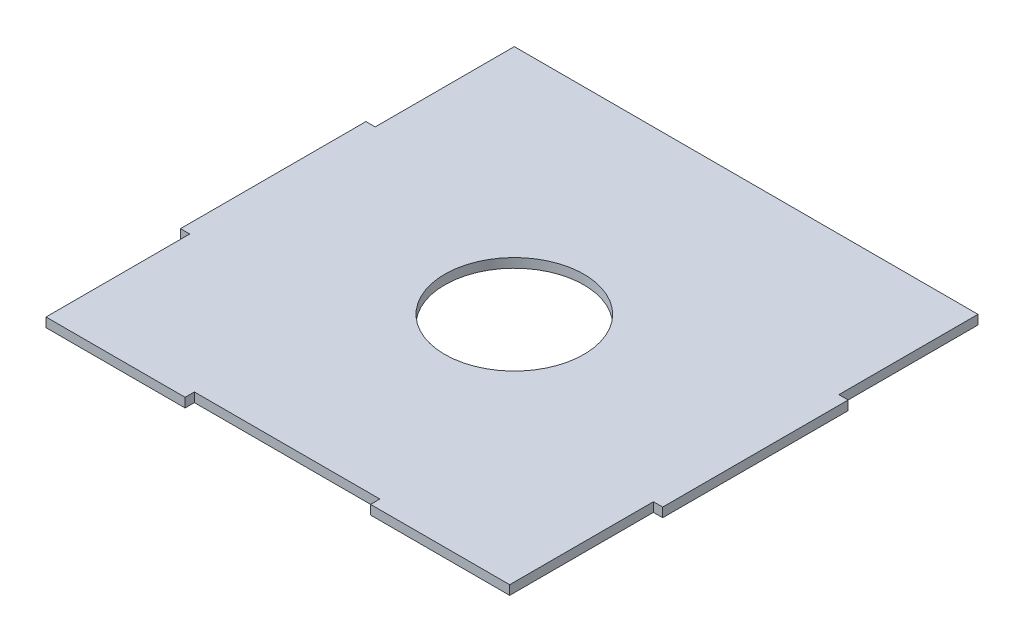
ISO-10303-21;
HEADER;
FILE_DESCRIPTION(('STEP AP214'),'2;1');
FILE_NAME('part.step','',(''),(''),'','','');
FILE_SCHEMA(('AUTOMOTIVE_DESIGN { 1 0 10303 214 1 1 1 1 }'));
ENDSEC;
DATA;
#1=APPLICATION_CONTEXT('core data for automotive mechanical design processes');
#2=APPLICATION_PROTOCOL_DEFINITION('international standard','automotive_design',2000,#1);
#3=PRODUCT_CONTEXT('',#1,'mechanical');
#4=PRODUCT('Part','Part','',(#3));
#5=PRODUCT_RELATED_PRODUCT_CATEGORY('part','',(#4));
#6=PRODUCT_DEFINITION_FORMATION('','',#4);
#7=PRODUCT_DEFINITION_CONTEXT('part definition',#1,'design');
#8=PRODUCT_DEFINITION('design','',#6,#7);
#9=PRODUCT_DEFINITION_SHAPE('','',#8);
#10=(LENGTH_UNIT() NAMED_UNIT(*) SI_UNIT(.MILLI.,.METRE.));
#11=(NAMED_UNIT(*) PLANE_ANGLE_UNIT() SI_UNIT($,.RADIAN.));
#12=(NAMED_UNIT(*) SI_UNIT($,.STERADIAN.) SOLID_ANGLE_UNIT());
#13=UNCERTAINTY_MEASURE_WITH_UNIT(LENGTH_MEASURE(1.E-05),#10,'distance_accuracy_value','');
#14=(GEOMETRIC_REPRESENTATION_CONTEXT(3) GLOBAL_UNCERTAINTY_ASSIGNED_CONTEXT((#13)) GLOBAL_UNIT_ASSIGNED_CONTEXT((#10,
#11,#12)) REPRESENTATION_CONTEXT('',''));
#15=CARTESIAN_POINT('',(0.,0.,0.));
#16=DIRECTION('',(0.,0.,1.));
#17=DIRECTION('',(1.,0.,0.));
#18=AXIS2_PLACEMENT_3D('',#15,#16,#17);
#19=CARTESIAN_POINT('',(50.,2.,-50.));
#20=DIRECTION('',(0.,-1.,0.));
#21=DIRECTION('',(0.,0.,-1.));
#22=AXIS2_PLACEMENT_3D('',#19,#20,#21);
#23=CYLINDRICAL_SURFACE('',#22,15.);
#24=CARTESIAN_POINT('',(50.,2.,-50.));
#25=DIRECTION('',(0.,1.,0.));
#26=DIRECTION('',(0.,0.,1.));
#27=AXIS2_PLACEMENT_3D('',#24,#25,#26);
#28=CIRCLE('',#27,15.);
#29=CARTESIAN_POINT('',(50.,2.,-35.));
#30=VERTEX_POINT('',#29);
#31=EDGE_CURVE('E213',#30,#30,#28,.T.);
#32=ORIENTED_EDGE('',*,*,#31,.T.);
#33=EDGE_LOOP('',(#32));
#34=FACE_BOUND('',#33,.T.);
#35=CARTESIAN_POINT('',(50.,0.,-50.));
#36=DIRECTION('',(0.,1.,0.));
#37=DIRECTION('',(0.,0.,1.));
#38=AXIS2_PLACEMENT_3D('',#35,#36,#37);
#39=CIRCLE('',#38,15.);
#40=CARTESIAN_POINT('',(50.,0.,-35.));
#41=VERTEX_POINT('',#40);
#42=EDGE_CURVE('E214',#41,#41,#39,.T.);
#43=ORIENTED_EDGE('',*,*,#42,.F.);
#44=EDGE_LOOP('',(#43));
#45=FACE_BOUND('',#44,.T.);
#46=ADVANCED_FACE('F45',(#34,#45),#23,.F.);
#47=CARTESIAN_POINT('',(0.,2.,-30.));
#48=DIRECTION('',(0.,0.,-1.));
#49=DIRECTION('',(-1.,0.,0.));
#50=AXIS2_PLACEMENT_3D('',#47,#48,#49);
#51=PLANE('',#50);
#52=DIRECTION('',(1.,0.,0.));
#53=VECTOR('',#52,1.);
#54=CARTESIAN_POINT('',(0.,0.,-30.));
#55=LINE('',#54,#53);
#56=CARTESIAN_POINT('',(-2.,0.,-30.));
#57=VERTEX_POINT('',#56);
#58=CARTESIAN_POINT('',(0.,0.,-30.));
#59=VERTEX_POINT('',#58);
#60=EDGE_CURVE('E252',#57,#59,#55,.T.);
#61=ORIENTED_EDGE('',*,*,#60,.T.);
#62=DIRECTION('',(0.,-1.,0.));
#63=VECTOR('',#62,1.);
#64=CARTESIAN_POINT('',(0.,2.,-30.));
#65=LINE('',#64,#63);
#66=CARTESIAN_POINT('',(0.,2.,-30.));
#67=VERTEX_POINT('',#66);
#68=EDGE_CURVE('E56',#67,#59,#65,.T.);
#69=ORIENTED_EDGE('',*,*,#68,.F.);
#70=DIRECTION('',(1.,0.,0.));
#71=VECTOR('',#70,1.);
#72=CARTESIAN_POINT('',(0.,2.,-30.));
#73=LINE('',#72,#71);
#74=CARTESIAN_POINT('',(-2.,2.,-30.));
#75=VERTEX_POINT('',#74);
#76=EDGE_CURVE('E302',#75,#67,#73,.T.);
#77=ORIENTED_EDGE('',*,*,#76,.F.);
#78=DIRECTION('',(0.,-1.,0.));
#79=VECTOR('',#78,1.);
#80=CARTESIAN_POINT('',(-2.,2.,-30.));
#81=LINE('',#80,#79);
#82=EDGE_CURVE('E11',#75,#57,#81,.T.);
#83=ORIENTED_EDGE('',*,*,#82,.T.);
#84=EDGE_LOOP('',(#61,#69,#77,#83));
#85=FACE_BOUND('',#84,.T.);
#86=ADVANCED_FACE('F321',(#85),#51,.F.);
#87=CARTESIAN_POINT('',(0.,2.,0.));
#88=DIRECTION('',(-1.,0.,0.));
#89=DIRECTION('',(0.,0.,1.));
#90=AXIS2_PLACEMENT_3D('',#87,#88,#89);
#91=PLANE('',#90);
#92=DIRECTION('',(0.,0.,-1.));
#93=VECTOR('',#92,1.);
#94=CARTESIAN_POINT('',(0.,0.,0.));
#95=LINE('',#94,#93);
#96=CARTESIAN_POINT('',(0.,0.,1.00000000000001));
#97=VERTEX_POINT('',#96);
#98=EDGE_CURVE('E248',#97,#59,#95,.T.);
#99=ORIENTED_EDGE('',*,*,#98,.F.);
#100=DIRECTION('',(0.,-1.,0.));
#101=VECTOR('',#100,1.);
#102=CARTESIAN_POINT('',(0.,2.,1.00000000000001));
#103=LINE('',#102,#101);
#104=CARTESIAN_POINT('',(0.,2.,1.00000000000001));
#105=VERTEX_POINT('',#104);
#106=EDGE_CURVE('E169',#105,#97,#103,.T.);
#107=ORIENTED_EDGE('',*,*,#106,.F.);
#108=DIRECTION('',(0.,0.,-1.));
#109=VECTOR('',#108,1.);
#110=CARTESIAN_POINT('',(0.,2.,0.));
#111=LINE('',#110,#109);
#112=EDGE_CURVE('E298',#105,#67,#111,.T.);
#113=ORIENTED_EDGE('',*,*,#112,.T.);
#114=ORIENTED_EDGE('',*,*,#68,.T.);
#115=EDGE_LOOP('',(#99,#107,#113,#114));
#116=FACE_BOUND('',#115,.T.);
#117=ADVANCED_FACE('F326',(#116),#91,.T.);
#118=CARTESIAN_POINT('',(30.,2.,0.));
#119=DIRECTION('',(-1.,0.,0.));
#120=DIRECTION('',(0.,0.,1.));
#121=AXIS2_PLACEMENT_3D('',#118,#119,#120);
#122=PLANE('',#121);
#123=DIRECTION('',(0.,0.,-1.));
#124=VECTOR('',#123,1.);
#125=CARTESIAN_POINT('',(30.,0.,0.));
#126=LINE('',#125,#124);
#127=CARTESIAN_POINT('',(30.,0.,1.));
#128=VERTEX_POINT('',#127);
#129=CARTESIAN_POINT('',(30.,0.,-1.));
#130=VERTEX_POINT('',#129);
#131=EDGE_CURVE('E245',#128,#130,#126,.T.);
#132=ORIENTED_EDGE('',*,*,#131,.T.);
#133=DIRECTION('',(0.,-1.,0.));
#134=VECTOR('',#133,1.);
#135=CARTESIAN_POINT('',(30.,2.,-1.));
#136=LINE('',#135,#134);
#137=CARTESIAN_POINT('',(30.,2.,-1.));
#138=VERTEX_POINT('',#137);
#139=EDGE_CURVE('E183',#138,#130,#136,.T.);
#140=ORIENTED_EDGE('',*,*,#139,.F.);
#141=DIRECTION('',(0.,0.,-1.));
#142=VECTOR('',#141,1.);
#143=CARTESIAN_POINT('',(30.,2.,0.));
#144=LINE('',#143,#142);
#145=CARTESIAN_POINT('',(30.,2.,1.));
#146=VERTEX_POINT('',#145);
#147=EDGE_CURVE('E294',#146,#138,#144,.T.);
#148=ORIENTED_EDGE('',*,*,#147,.F.);
#149=DIRECTION('',(0.,-1.,0.));
#150=VECTOR('',#149,1.);
#151=CARTESIAN_POINT('',(30.,2.,1.));
#152=LINE('',#151,#150);
#153=EDGE_CURVE('E164',#146,#128,#152,.T.);
#154=ORIENTED_EDGE('',*,*,#153,.T.);
#155=EDGE_LOOP('',(#132,#140,#148,#154));
#156=FACE_BOUND('',#155,.T.);
#157=ADVANCED_FACE('F334',(#156),#122,.F.);
#158=CARTESIAN_POINT('',(0.,2.,-0.999999999999998));
#159=DIRECTION('',(0.,0.,-1.));
#160=DIRECTION('',(-1.,0.,0.));
#161=AXIS2_PLACEMENT_3D('',#158,#159,#160);
#162=PLANE('',#161);
#163=DIRECTION('',(1.,0.,0.));
#164=VECTOR('',#163,1.);
#165=CARTESIAN_POINT('',(0.,0.,-0.999999999999998));
#166=LINE('',#165,#164);
#167=CARTESIAN_POINT('',(70.,0.,-1.));
#168=VERTEX_POINT('',#167);
#169=EDGE_CURVE('E147',#130,#168,#166,.T.);
#170=ORIENTED_EDGE('',*,*,#169,.T.);
#171=DIRECTION('',(0.,-1.,0.));
#172=VECTOR('',#171,1.);
#173=CARTESIAN_POINT('',(70.,2.,-1.));
#174=LINE('',#173,#172);
#175=CARTESIAN_POINT('',(70.,2.,-1.));
#176=VERTEX_POINT('',#175);
#177=EDGE_CURVE('E143',#176,#168,#174,.T.);
#178=ORIENTED_EDGE('',*,*,#177,.F.);
#179=DIRECTION('',(1.,0.,0.));
#180=VECTOR('',#179,1.);
#181=CARTESIAN_POINT('',(0.,2.,-0.999999999999998));
#182=LINE('',#181,#180);
#183=EDGE_CURVE('E290',#138,#176,#182,.T.);
#184=ORIENTED_EDGE('',*,*,#183,.F.);
#185=ORIENTED_EDGE('',*,*,#139,.T.);
#186=EDGE_LOOP('',(#170,#178,#184,#185));
#187=FACE_BOUND('',#186,.T.);
#188=ADVANCED_FACE('F339',(#187),#162,.F.);
#189=CARTESIAN_POINT('',(70.,2.,0.));
#190=DIRECTION('',(-1.,0.,0.));
#191=DIRECTION('',(0.,0.,1.));
#192=AXIS2_PLACEMENT_3D('',#189,#190,#191);
#193=PLANE('',#192);
#194=DIRECTION('',(0.,0.,-1.));
#195=VECTOR('',#194,1.);
#196=CARTESIAN_POINT('',(70.,0.,0.));
#197=LINE('',#196,#195);
#198=CARTESIAN_POINT('',(70.,0.,1.));
#199=VERTEX_POINT('',#198);
#200=EDGE_CURVE('E136',#199,#168,#197,.T.);
#201=ORIENTED_EDGE('',*,*,#200,.F.);
#202=DIRECTION('',(0.,-1.,0.));
#203=VECTOR('',#202,1.);
#204=CARTESIAN_POINT('',(70.,2.,1.));
#205=LINE('',#204,#203);
#206=CARTESIAN_POINT('',(70.,2.,1.));
#207=VERTEX_POINT('',#206);
#208=EDGE_CURVE('E140',#207,#199,#205,.T.);
#209=ORIENTED_EDGE('',*,*,#208,.F.);
#210=DIRECTION('',(0.,0.,-1.));
#211=VECTOR('',#210,1.);
#212=CARTESIAN_POINT('',(70.,2.,0.));
#213=LINE('',#212,#211);
#214=EDGE_CURVE('E287',#207,#176,#213,.T.);
#215=ORIENTED_EDGE('',*,*,#214,.T.);
#216=ORIENTED_EDGE('',*,*,#177,.T.);
#217=EDGE_LOOP('',(#201,#209,#215,#216));
#218=FACE_BOUND('',#217,.T.);
#219=ADVANCED_FACE('F138',(#218),#193,.T.);
#220=CARTESIAN_POINT('',(100.,2.,0.));
#221=DIRECTION('',(-1.,0.,0.));
#222=DIRECTION('',(0.,0.,1.));
#223=AXIS2_PLACEMENT_3D('',#220,#221,#222);
#224=PLANE('',#223);
#225=DIRECTION('',(0.,0.,-1.));
#226=VECTOR('',#225,1.);
#227=CARTESIAN_POINT('',(100.,0.,0.));
#228=LINE('',#227,#226);
#229=CARTESIAN_POINT('',(100.,0.,1.));
#230=VERTEX_POINT('',#229);
#231=CARTESIAN_POINT('',(100.,0.,-30.));
#232=VERTEX_POINT('',#231);
#233=EDGE_CURVE('E130',#230,#232,#228,.T.);
#234=ORIENTED_EDGE('',*,*,#233,.T.);
#235=DIRECTION('',(0.,-1.,0.));
#236=VECTOR('',#235,1.);
#237=CARTESIAN_POINT('',(100.,2.,-30.));
#238=LINE('',#237,#236);
#239=CARTESIAN_POINT('',(100.,2.,-30.));
#240=VERTEX_POINT('',#239);
#241=EDGE_CURVE('E189',#240,#232,#238,.T.);
#242=ORIENTED_EDGE('',*,*,#241,.F.);
#243=DIRECTION('',(0.,0.,-1.));
#244=VECTOR('',#243,1.);
#245=CARTESIAN_POINT('',(100.,2.,0.));
#246=LINE('',#245,#244);
#247=CARTESIAN_POINT('',(100.,2.,1.));
#248=VERTEX_POINT('',#247);
#249=EDGE_CURVE('E283',#248,#240,#246,.T.);
#250=ORIENTED_EDGE('',*,*,#249,.F.);
#251=DIRECTION('',(0.,-1.,0.));
#252=VECTOR('',#251,1.);
#253=CARTESIAN_POINT('',(100.,2.,1.));
#254=LINE('',#253,#252);
#255=EDGE_CURVE('E49',#248,#230,#254,.T.);
#256=ORIENTED_EDGE('',*,*,#255,.T.);
#257=EDGE_LOOP('',(#234,#242,#250,#256));
#258=FACE_BOUND('',#257,.T.);
#259=ADVANCED_FACE('F376',(#258),#224,.F.);
#260=CARTESIAN_POINT('',(0.,2.,-30.));
#261=DIRECTION('',(0.,0.,-1.));
#262=DIRECTION('',(-1.,0.,0.));
#263=AXIS2_PLACEMENT_3D('',#260,#261,#262);
#264=PLANE('',#263);
#265=DIRECTION('',(1.,0.,0.));
#266=VECTOR('',#265,1.);
#267=CARTESIAN_POINT('',(0.,0.,-30.));
#268=LINE('',#267,#266);
#269=CARTESIAN_POINT('',(102.,0.,-30.));
#270=VERTEX_POINT('',#269);
#271=EDGE_CURVE('E237',#232,#270,#268,.T.);
#272=ORIENTED_EDGE('',*,*,#271,.T.);
#273=DIRECTION('',(0.,-1.,0.));
#274=VECTOR('',#273,1.);
#275=CARTESIAN_POINT('',(102.,2.,-30.));
#276=LINE('',#275,#274);
#277=CARTESIAN_POINT('',(102.,2.,-30.));
#278=VERTEX_POINT('',#277);
#279=EDGE_CURVE('E193',#278,#270,#276,.T.);
#280=ORIENTED_EDGE('',*,*,#279,.F.);
#281=DIRECTION('',(1.,0.,0.));
#282=VECTOR('',#281,1.);
#283=CARTESIAN_POINT('',(0.,2.,-30.));
#284=LINE('',#283,#282);
#285=EDGE_CURVE('E279',#240,#278,#284,.T.);
#286=ORIENTED_EDGE('',*,*,#285,.F.);
#287=ORIENTED_EDGE('',*,*,#241,.T.);
#288=EDGE_LOOP('',(#272,#280,#286,#287));
#289=FACE_BOUND('',#288,.T.);
#290=ADVANCED_FACE('F382',(#289),#264,.F.);
#291=CARTESIAN_POINT('',(102.,2.,0.));
#292=DIRECTION('',(1.,0.,0.));
#293=DIRECTION('',(0.,0.,-1.));
#294=AXIS2_PLACEMENT_3D('',#291,#292,#293);
#295=PLANE('',#294);
#296=DIRECTION('',(0.,0.,1.));
#297=VECTOR('',#296,1.);
#298=CARTESIAN_POINT('',(102.,0.,0.));
#299=LINE('',#298,#297);
#300=CARTESIAN_POINT('',(102.,0.,-70.));
#301=VERTEX_POINT('',#300);
#302=EDGE_CURVE('E233',#301,#270,#299,.T.);
#303=ORIENTED_EDGE('',*,*,#302,.F.);
#304=DIRECTION('',(0.,-1.,0.));
#305=VECTOR('',#304,1.);
#306=CARTESIAN_POINT('',(102.,2.,-70.));
#307=LINE('',#306,#305);
#308=CARTESIAN_POINT('',(102.,2.,-70.));
#309=VERTEX_POINT('',#308);
#310=EDGE_CURVE('E196',#309,#301,#307,.T.);
#311=ORIENTED_EDGE('',*,*,#310,.F.);
#312=DIRECTION('',(0.,0.,1.));
#313=VECTOR('',#312,1.);
#314=CARTESIAN_POINT('',(102.,2.,0.));
#315=LINE('',#314,#313);
#316=EDGE_CURVE('E275',#309,#278,#315,.T.);
#317=ORIENTED_EDGE('',*,*,#316,.T.);
#318=ORIENTED_EDGE('',*,*,#279,.T.);
#319=EDGE_LOOP('',(#303,#311,#317,#318));
#320=FACE_BOUND('',#319,.T.);
#321=ADVANCED_FACE('F385',(#320),#295,.T.);
#322=CARTESIAN_POINT('',(0.,2.,-70.));
#323=DIRECTION('',(0.,0.,-1.));
#324=DIRECTION('',(-1.,0.,0.));
#325=AXIS2_PLACEMENT_3D('',#322,#323,#324);
#326=PLANE('',#325);
#327=DIRECTION('',(1.,0.,0.));
#328=VECTOR('',#327,1.);
#329=CARTESIAN_POINT('',(0.,0.,-70.));
#330=LINE('',#329,#328);
#331=CARTESIAN_POINT('',(100.,0.,-70.));
#332=VERTEX_POINT('',#331);
#333=EDGE_CURVE('E229',#332,#301,#330,.T.);
#334=ORIENTED_EDGE('',*,*,#333,.F.);
#335=DIRECTION('',(0.,-1.,0.));
#336=VECTOR('',#335,1.);
#337=CARTESIAN_POINT('',(100.,2.,-70.));
#338=LINE('',#337,#336);
#339=CARTESIAN_POINT('',(100.,2.,-70.));
#340=VERTEX_POINT('',#339);
#341=EDGE_CURVE('E199',#340,#332,#338,.T.);
#342=ORIENTED_EDGE('',*,*,#341,.F.);
#343=DIRECTION('',(1.,0.,0.));
#344=VECTOR('',#343,1.);
#345=CARTESIAN_POINT('',(0.,2.,-70.));
#346=LINE('',#345,#344);
#347=EDGE_CURVE('E271',#340,#309,#346,.T.);
#348=ORIENTED_EDGE('',*,*,#347,.T.);
#349=ORIENTED_EDGE('',*,*,#310,.T.);
#350=EDGE_LOOP('',(#334,#342,#348,#349));
#351=FACE_BOUND('',#350,.T.);
#352=ADVANCED_FACE('F388',(#351),#326,.T.);
#353=CARTESIAN_POINT('',(100.,0.,-100.));
#354=VERTEX_POINT('',#353);
#355=EDGE_CURVE('E228',#332,#354,#228,.T.);
#356=ORIENTED_EDGE('',*,*,#355,.T.);
#357=DIRECTION('',(0.,-1.,0.));
#358=VECTOR('',#357,1.);
#359=CARTESIAN_POINT('',(100.,2.,-100.));
#360=LINE('',#359,#358);
#361=CARTESIAN_POINT('',(100.,2.,-100.));
#362=VERTEX_POINT('',#361);
#363=EDGE_CURVE('E202',#362,#354,#360,.T.);
#364=ORIENTED_EDGE('',*,*,#363,.F.);
#365=EDGE_CURVE('E270',#340,#362,#246,.T.);
#366=ORIENTED_EDGE('',*,*,#365,.F.);
#367=ORIENTED_EDGE('',*,*,#341,.T.);
#368=EDGE_LOOP('',(#356,#364,#366,#367));
#369=FACE_BOUND('',#368,.T.);
#370=ADVANCED_FACE('F390',(#369),#224,.F.);
#371=CARTESIAN_POINT('',(0.,2.,-100.));
#372=DIRECTION('',(0.,0.,-1.));
#373=DIRECTION('',(-1.,0.,0.));
#374=AXIS2_PLACEMENT_3D('',#371,#372,#373);
#375=PLANE('',#374);
#376=DIRECTION('',(1.,0.,0.));
#377=VECTOR('',#376,1.);
#378=CARTESIAN_POINT('',(0.,0.,-100.));
#379=LINE('',#378,#377);
#380=CARTESIAN_POINT('',(0.,0.,-100.));
#381=VERTEX_POINT('',#380);
#382=EDGE_CURVE('E224',#381,#354,#379,.T.);
#383=ORIENTED_EDGE('',*,*,#382,.F.);
#384=DIRECTION('',(0.,-1.,0.));
#385=VECTOR('',#384,1.);
#386=CARTESIAN_POINT('',(0.,2.,-100.));
#387=LINE('',#386,#385);
#388=CARTESIAN_POINT('',(0.,2.,-100.));
#389=VERTEX_POINT('',#388);
#390=EDGE_CURVE('E205',#389,#381,#387,.T.);
#391=ORIENTED_EDGE('',*,*,#390,.F.);
#392=DIRECTION('',(1.,0.,0.));
#393=VECTOR('',#392,1.);
#394=CARTESIAN_POINT('',(0.,2.,-100.));
#395=LINE('',#394,#393);
#396=EDGE_CURVE('E266',#389,#362,#395,.T.);
#397=ORIENTED_EDGE('',*,*,#396,.T.);
#398=ORIENTED_EDGE('',*,*,#363,.T.);
#399=EDGE_LOOP('',(#383,#391,#397,#398));
#400=FACE_BOUND('',#399,.T.);
#401=ADVANCED_FACE('F358',(#400),#375,.T.);
#402=CARTESIAN_POINT('',(0.,0.,-70.));
#403=VERTEX_POINT('',#402);
#404=EDGE_CURVE('E223',#403,#381,#95,.T.);
#405=ORIENTED_EDGE('',*,*,#404,.F.);
#406=DIRECTION('',(0.,-1.,0.));
#407=VECTOR('',#406,1.);
#408=CARTESIAN_POINT('',(0.,2.,-70.));
#409=LINE('',#408,#407);
#410=CARTESIAN_POINT('',(0.,2.,-70.));
#411=VERTEX_POINT('',#410);
#412=EDGE_CURVE('E208',#411,#403,#409,.T.);
#413=ORIENTED_EDGE('',*,*,#412,.F.);
#414=EDGE_CURVE('E265',#411,#389,#111,.T.);
#415=ORIENTED_EDGE('',*,*,#414,.T.);
#416=ORIENTED_EDGE('',*,*,#390,.T.);
#417=EDGE_LOOP('',(#405,#413,#415,#416));
#418=FACE_BOUND('',#417,.T.);
#419=ADVANCED_FACE('F366',(#418),#91,.T.);
#420=CARTESIAN_POINT('',(0.,2.,-70.));
#421=DIRECTION('',(0.,0.,-1.));
#422=DIRECTION('',(-1.,0.,0.));
#423=AXIS2_PLACEMENT_3D('',#420,#421,#422);
#424=PLANE('',#423);
#425=DIRECTION('',(1.,0.,0.));
#426=VECTOR('',#425,1.);
#427=CARTESIAN_POINT('',(0.,0.,-70.));
#428=LINE('',#427,#426);
#429=CARTESIAN_POINT('',(-2.,0.,-70.));
#430=VERTEX_POINT('',#429);
#431=EDGE_CURVE('E219',#430,#403,#428,.T.);
#432=ORIENTED_EDGE('',*,*,#431,.F.);
#433=DIRECTION('',(0.,-1.,0.));
#434=VECTOR('',#433,1.);
#435=CARTESIAN_POINT('',(-2.,2.,-70.));
#436=LINE('',#435,#434);
#437=CARTESIAN_POINT('',(-2.,2.,-70.));
#438=VERTEX_POINT('',#437);
#439=EDGE_CURVE('E65',#438,#430,#436,.T.);
#440=ORIENTED_EDGE('',*,*,#439,.F.);
#441=DIRECTION('',(1.,0.,0.));
#442=VECTOR('',#441,1.);
#443=CARTESIAN_POINT('',(0.,2.,-70.));
#444=LINE('',#443,#442);
#445=EDGE_CURVE('E262',#438,#411,#444,.T.);
#446=ORIENTED_EDGE('',*,*,#445,.T.);
#447=ORIENTED_EDGE('',*,*,#412,.T.);
#448=EDGE_LOOP('',(#432,#440,#446,#447));
#449=FACE_BOUND('',#448,.T.);
#450=ADVANCED_FACE('F369',(#449),#424,.T.);
#451=CARTESIAN_POINT('',(-2.,2.,0.));
#452=DIRECTION('',(1.,0.,0.));
#453=DIRECTION('',(0.,0.,-1.));
#454=AXIS2_PLACEMENT_3D('',#451,#452,#453);
#455=PLANE('',#454);
#456=DIRECTION('',(0.,0.,1.));
#457=VECTOR('',#456,1.);
#458=CARTESIAN_POINT('',(-2.,0.,0.));
#459=LINE('',#458,#457);
#460=EDGE_CURVE('E168',#430,#57,#459,.T.);
#461=ORIENTED_EDGE('',*,*,#460,.T.);
#462=ORIENTED_EDGE('',*,*,#82,.F.);
#463=DIRECTION('',(0.,0.,1.));
#464=VECTOR('',#463,1.);
#465=CARTESIAN_POINT('',(-2.,2.,0.));
#466=LINE('',#465,#464);
#467=EDGE_CURVE('E218',#438,#75,#466,.T.);
#468=ORIENTED_EDGE('',*,*,#467,.F.);
#469=ORIENTED_EDGE('',*,*,#439,.T.);
#470=EDGE_LOOP('',(#461,#462,#468,#469));
#471=FACE_BOUND('',#470,.T.);
#472=ADVANCED_FACE('F319',(#471),#455,.F.);
#473=CARTESIAN_POINT('',(0.,0.,0.));
#474=DIRECTION('',(0.,1.,0.));
#475=DIRECTION('',(0.,0.,1.));
#476=AXIS2_PLACEMENT_3D('',#473,#474,#475);
#477=PLANE('',#476);
#478=ORIENTED_EDGE('',*,*,#460,.F.);
#479=ORIENTED_EDGE('',*,*,#431,.T.);
#480=ORIENTED_EDGE('',*,*,#404,.T.);
#481=ORIENTED_EDGE('',*,*,#382,.T.);
#482=ORIENTED_EDGE('',*,*,#355,.F.);
#483=ORIENTED_EDGE('',*,*,#333,.T.);
#484=ORIENTED_EDGE('',*,*,#302,.T.);
#485=ORIENTED_EDGE('',*,*,#271,.F.);
#486=ORIENTED_EDGE('',*,*,#233,.F.);
#487=DIRECTION('',(1.,0.,0.));
#488=VECTOR('',#487,1.);
#489=CARTESIAN_POINT('',(70.,0.,1.));
#490=LINE('',#489,#488);
#491=EDGE_CURVE('E152',#199,#230,#490,.T.);
#492=ORIENTED_EDGE('',*,*,#491,.F.);
#493=ORIENTED_EDGE('',*,*,#200,.T.);
#494=ORIENTED_EDGE('',*,*,#169,.F.);
#495=ORIENTED_EDGE('',*,*,#131,.F.);
#496=DIRECTION('',(1.,0.,0.));
#497=VECTOR('',#496,1.);
#498=CARTESIAN_POINT('',(0.,0.,1.00000000000001));
#499=LINE('',#498,#497);
#500=EDGE_CURVE('E174',#97,#128,#499,.T.);
#501=ORIENTED_EDGE('',*,*,#500,.F.);
#502=ORIENTED_EDGE('',*,*,#98,.T.);
#503=ORIENTED_EDGE('',*,*,#60,.F.);
#504=EDGE_LOOP('',(#478,#479,#480,#481,#482,#483,#484,#485,#486,#492,#493,#494,#495,#501,#502,#503));
#505=FACE_BOUND('',#504,.T.);
#506=ORIENTED_EDGE('',*,*,#42,.T.);
#507=EDGE_LOOP('',(#506));
#508=FACE_BOUND('',#507,.T.);
#509=ADVANCED_FACE('F157',(#505,#508),#477,.F.);
#510=CARTESIAN_POINT('',(0.,2.,0.));
#511=DIRECTION('',(0.,1.,0.));
#512=DIRECTION('',(0.,0.,1.));
#513=AXIS2_PLACEMENT_3D('',#510,#511,#512);
#514=PLANE('',#513);
#515=ORIENTED_EDGE('',*,*,#467,.T.);
#516=ORIENTED_EDGE('',*,*,#76,.T.);
#517=ORIENTED_EDGE('',*,*,#112,.F.);
#518=DIRECTION('',(1.,0.,0.));
#519=VECTOR('',#518,1.);
#520=CARTESIAN_POINT('',(0.,2.,1.00000000000001));
#521=LINE('',#520,#519);
#522=EDGE_CURVE('E173',#105,#146,#521,.T.);
#523=ORIENTED_EDGE('',*,*,#522,.T.);
#524=ORIENTED_EDGE('',*,*,#147,.T.);
#525=ORIENTED_EDGE('',*,*,#183,.T.);
#526=ORIENTED_EDGE('',*,*,#214,.F.);
#527=DIRECTION('',(1.,0.,0.));
#528=VECTOR('',#527,1.);
#529=CARTESIAN_POINT('',(70.,2.,1.));
#530=LINE('',#529,#528);
#531=EDGE_CURVE('E154',#207,#248,#530,.T.);
#532=ORIENTED_EDGE('',*,*,#531,.T.);
#533=ORIENTED_EDGE('',*,*,#249,.T.);
#534=ORIENTED_EDGE('',*,*,#285,.T.);
#535=ORIENTED_EDGE('',*,*,#316,.F.);
#536=ORIENTED_EDGE('',*,*,#347,.F.);
#537=ORIENTED_EDGE('',*,*,#365,.T.);
#538=ORIENTED_EDGE('',*,*,#396,.F.);
#539=ORIENTED_EDGE('',*,*,#414,.F.);
#540=ORIENTED_EDGE('',*,*,#445,.F.);
#541=EDGE_LOOP('',(#515,#516,#517,#523,#524,#525,#526,#532,#533,#534,#535,#536,#537,#538,#539,#540));
#542=FACE_BOUND('',#541,.T.);
#543=ORIENTED_EDGE('',*,*,#31,.F.);
#544=EDGE_LOOP('',(#543));
#545=FACE_BOUND('',#544,.T.);
#546=ADVANCED_FACE('F311',(#542,#545),#514,.T.);
#547=CARTESIAN_POINT('',(70.,2.,1.));
#548=DIRECTION('',(0.,0.,-1.));
#549=DIRECTION('',(-1.,0.,0.));
#550=AXIS2_PLACEMENT_3D('',#547,#548,#549);
#551=PLANE('',#550);
#552=ORIENTED_EDGE('',*,*,#491,.T.);
#553=ORIENTED_EDGE('',*,*,#255,.F.);
#554=ORIENTED_EDGE('',*,*,#531,.F.);
#555=ORIENTED_EDGE('',*,*,#208,.T.);
#556=EDGE_LOOP('',(#552,#553,#554,#555));
#557=FACE_BOUND('',#556,.T.);
#558=ADVANCED_FACE('F47',(#557),#551,.F.);
#559=CARTESIAN_POINT('',(0.,2.,1.00000000000001));
#560=DIRECTION('',(0.,0.,-1.));
#561=DIRECTION('',(-1.,0.,0.));
#562=AXIS2_PLACEMENT_3D('',#559,#560,#561);
#563=PLANE('',#562);
#564=ORIENTED_EDGE('',*,*,#500,.T.);
#565=ORIENTED_EDGE('',*,*,#153,.F.);
#566=ORIENTED_EDGE('',*,*,#522,.F.);
#567=ORIENTED_EDGE('',*,*,#106,.T.);
#568=EDGE_LOOP('',(#564,#565,#566,#567));
#569=FACE_BOUND('',#568,.T.);
#570=ADVANCED_FACE('F331',(#569),#563,.F.);
#571=CLOSED_SHELL('',(#46,#86,#117,#157,#188,#219,#259,#290,#321,#352,#370,#401,#419,#450,#472,
#509,#546,#558,#570));
#572=MANIFOLD_SOLID_BREP('B2',#571);
#573=ADVANCED_BREP_SHAPE_REPRESENTATION('',(#18,#572),#14);
#574=SHAPE_DEFINITION_REPRESENTATION(#9,#573);
ENDSEC;
END-ISO-10303-21;
